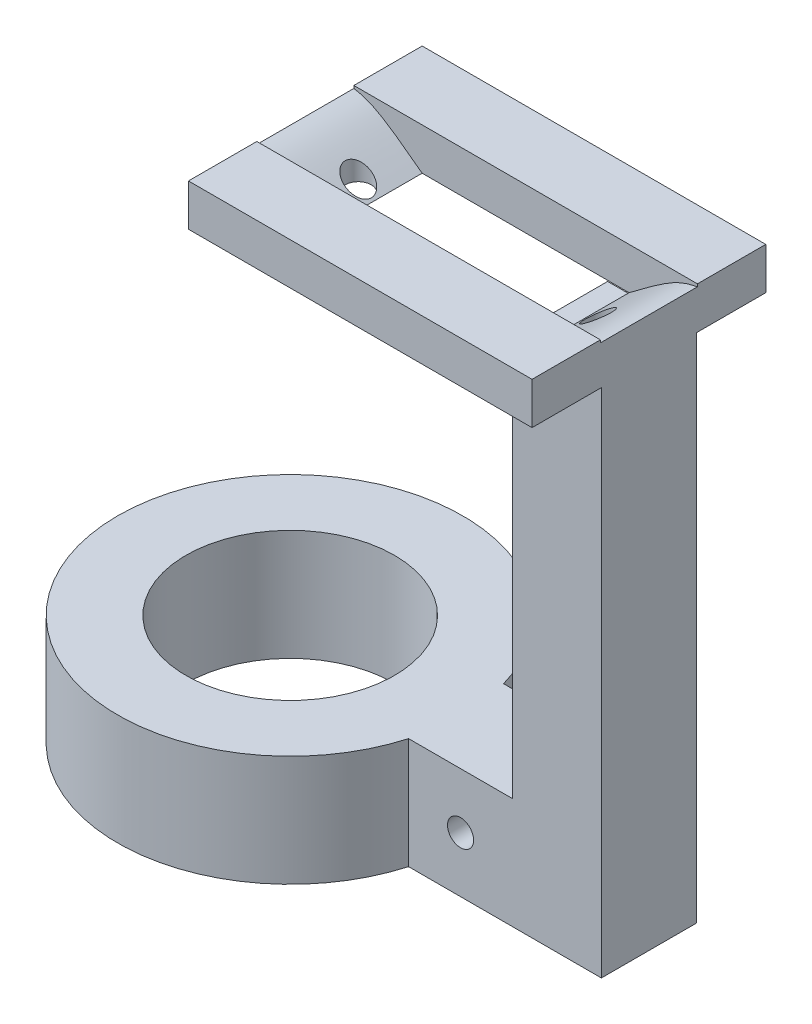
ISO-10303-21;
HEADER;
FILE_DESCRIPTION(('STEP AP214'),'2;1');
FILE_NAME('part.step','',(''),(''),'','','');
FILE_SCHEMA(('AUTOMOTIVE_DESIGN { 1 0 10303 214 1 1 1 1 }'));
ENDSEC;
DATA;
#1=APPLICATION_CONTEXT('core data for automotive mechanical design processes');
#2=APPLICATION_PROTOCOL_DEFINITION('international standard','automotive_design',2000,#1);
#3=PRODUCT_CONTEXT('',#1,'mechanical');
#4=PRODUCT('Part','Part','',(#3));
#5=PRODUCT_RELATED_PRODUCT_CATEGORY('part','',(#4));
#6=PRODUCT_DEFINITION_FORMATION('','',#4);
#7=PRODUCT_DEFINITION_CONTEXT('part definition',#1,'design');
#8=PRODUCT_DEFINITION('design','',#6,#7);
#9=PRODUCT_DEFINITION_SHAPE('','',#8);
#10=(LENGTH_UNIT() NAMED_UNIT(*) SI_UNIT(.MILLI.,.METRE.));
#11=(NAMED_UNIT(*) PLANE_ANGLE_UNIT() SI_UNIT($,.RADIAN.));
#12=(NAMED_UNIT(*) SI_UNIT($,.STERADIAN.) SOLID_ANGLE_UNIT());
#13=UNCERTAINTY_MEASURE_WITH_UNIT(LENGTH_MEASURE(1.E-05),#10,'distance_accuracy_value','');
#14=(GEOMETRIC_REPRESENTATION_CONTEXT(3) GLOBAL_UNCERTAINTY_ASSIGNED_CONTEXT((#13)) GLOBAL_UNIT_ASSIGNED_CONTEXT((#10,
#11,#12)) REPRESENTATION_CONTEXT('',''));
#15=CARTESIAN_POINT('',(0.,0.,0.));
#16=DIRECTION('',(0.,0.,1.));
#17=DIRECTION('',(1.,0.,0.));
#18=AXIS2_PLACEMENT_3D('',#15,#16,#17);
#19=CARTESIAN_POINT('',(24.2045446236148,6.125,25.25));
#20=DIRECTION('',(0.,-1.,0.));
#21=DIRECTION('',(0.,0.,-1.));
#22=AXIS2_PLACEMENT_3D('',#19,#20,#21);
#23=PLANE('',#22);
#24=DIRECTION('',(0.,0.,1.));
#25=VECTOR('',#24,1.);
#26=CARTESIAN_POINT('',(25.14,6.125,-7.1));
#27=LINE('',#26,#25);
#28=CARTESIAN_POINT('',(25.14,6.125,7.1));
#29=VERTEX_POINT('',#28);
#30=CARTESIAN_POINT('',(25.14,6.125,17.1));
#31=VERTEX_POINT('',#30);
#32=EDGE_CURVE('E210',#29,#31,#27,.T.);
#33=ORIENTED_EDGE('',*,*,#32,.F.);
#34=DIRECTION('',(-1.,0.,0.));
#35=VECTOR('',#34,1.);
#36=CARTESIAN_POINT('',(-15.14,6.125,7.1));
#37=LINE('',#36,#35);
#38=CARTESIAN_POINT('',(-25.14,6.125,7.1));
#39=VERTEX_POINT('',#38);
#40=EDGE_CURVE('E219',#29,#39,#37,.T.);
#41=ORIENTED_EDGE('',*,*,#40,.T.);
#42=DIRECTION('',(0.,0.,-1.));
#43=VECTOR('',#42,1.);
#44=CARTESIAN_POINT('',(-25.14,6.125,25.25));
#45=LINE('',#44,#43);
#46=CARTESIAN_POINT('',(-25.14,6.125,17.1));
#47=VERTEX_POINT('',#46);
#48=EDGE_CURVE('E225',#47,#39,#45,.T.);
#49=ORIENTED_EDGE('',*,*,#48,.F.);
#50=DIRECTION('',(-1.,0.,0.));
#51=VECTOR('',#50,1.);
#52=CARTESIAN_POINT('',(-15.14,6.125,17.1));
#53=LINE('',#52,#51);
#54=EDGE_CURVE('E233',#31,#47,#53,.T.);
#55=ORIENTED_EDGE('',*,*,#54,.F.);
#56=EDGE_LOOP('',(#33,#41,#49,#55));
#57=FACE_BOUND('',#56,.T.);
#58=ADVANCED_FACE('F68',(#57),#23,.F.);
#59=CARTESIAN_POINT('',(12.14,-74.82,6.955));
#60=DIRECTION('',(1.,0.,0.));
#61=DIRECTION('',(0.,0.,-1.));
#62=AXIS2_PLACEMENT_3D('',#59,#60,#61);
#63=PLANE('',#62);
#64=DIRECTION('',(0.,0.,-1.));
#65=VECTOR('',#64,1.);
#66=CARTESIAN_POINT('',(12.14,-58.59,-6.955));
#67=LINE('',#66,#65);
#68=CARTESIAN_POINT('',(12.14,-58.59,6.955));
#69=VERTEX_POINT('',#68);
#70=CARTESIAN_POINT('',(12.14,-58.59,-6.955));
#71=VERTEX_POINT('',#70);
#72=EDGE_CURVE('E259',#69,#71,#67,.T.);
#73=ORIENTED_EDGE('',*,*,#72,.F.);
#74=DIRECTION('',(0.,1.,0.));
#75=VECTOR('',#74,1.);
#76=CARTESIAN_POINT('',(12.14,-74.82,6.955));
#77=LINE('',#76,#75);
#78=CARTESIAN_POINT('',(12.14,0.,6.955));
#79=VERTEX_POINT('',#78);
#80=EDGE_CURVE('E457',#69,#79,#77,.T.);
#81=ORIENTED_EDGE('',*,*,#80,.T.);
#82=DIRECTION('',(0.,0.,-1.));
#83=VECTOR('',#82,1.);
#84=CARTESIAN_POINT('',(12.14,0.,6.955));
#85=LINE('',#84,#83);
#86=CARTESIAN_POINT('',(12.14,0.,-6.955));
#87=VERTEX_POINT('',#86);
#88=EDGE_CURVE('E279',#79,#87,#85,.T.);
#89=ORIENTED_EDGE('',*,*,#88,.T.);
#90=DIRECTION('',(0.,1.,0.));
#91=VECTOR('',#90,1.);
#92=CARTESIAN_POINT('',(12.14,-74.82,-6.955));
#93=LINE('',#92,#91);
#94=EDGE_CURVE('E461',#71,#87,#93,.T.);
#95=ORIENTED_EDGE('',*,*,#94,.F.);
#96=EDGE_LOOP('',(#73,#81,#89,#95));
#97=FACE_BOUND('',#96,.T.);
#98=ADVANCED_FACE('F317',(#97),#63,.F.);
#99=CARTESIAN_POINT('',(0.,0.,0.));
#100=DIRECTION('',(0.,1.,0.));
#101=DIRECTION('',(0.,0.,1.));
#102=AXIS2_PLACEMENT_3D('',#99,#100,#101);
#103=PLANE('',#102);
#104=CARTESIAN_POINT('',(-17.395,0.,0.));
#105=DIRECTION('',(0.,1.,0.));
#106=DIRECTION('',(0.,0.,1.));
#107=AXIS2_PLACEMENT_3D('',#104,#105,#106);
#108=CIRCLE('',#107,1.91);
#109=CARTESIAN_POINT('',(-17.395,0.,1.91));
#110=VERTEX_POINT('',#109);
#111=EDGE_CURVE('E596',#110,#110,#108,.T.);
#112=ORIENTED_EDGE('',*,*,#111,.T.);
#113=EDGE_LOOP('',(#112));
#114=FACE_BOUND('',#113,.T.);
#115=DIRECTION('',(1.,0.,0.));
#116=VECTOR('',#115,1.);
#117=CARTESIAN_POINT('',(12.14,0.,-6.955));
#118=LINE('',#117,#116);
#119=CARTESIAN_POINT('',(15.14,0.,-6.955));
#120=VERTEX_POINT('',#119);
#121=CARTESIAN_POINT('',(25.14,0.,-6.955));
#122=VERTEX_POINT('',#121);
#123=EDGE_CURVE('E216',#120,#122,#118,.T.);
#124=ORIENTED_EDGE('',*,*,#123,.F.);
#125=CARTESIAN_POINT('',(15.14,0.,-7.81));
#126=CARTESIAN_POINT('',(15.14,0.,-2.60333333333333));
#127=CARTESIAN_POINT('',(15.14,0.,2.60333333333334));
#128=CARTESIAN_POINT('',(15.14,0.,7.81000000000001));
#129=(BOUNDED_CURVE() B_SPLINE_CURVE(3,(#125,#126,#127,#128),.UNSPECIFIED.,.F.,
.F.) B_SPLINE_CURVE_WITH_KNOTS((4,4),(-0.01491,0.000710000000000001),
.UNSPECIFIED.) CURVE() GEOMETRIC_REPRESENTATION_ITEM() RATIONAL_B_SPLINE_CURVE((1.,1.,1.,1.)) REPRESENTATION_ITEM(''));
#130=CARTESIAN_POINT('',(15.14,0.,-7.1));
#131=VERTEX_POINT('',#130);
#132=EDGE_CURVE('E419',#120,#131,#129,.F.);
#133=ORIENTED_EDGE('',*,*,#132,.T.);
#134=DIRECTION('',(-1.,0.,0.));
#135=VECTOR('',#134,1.);
#136=CARTESIAN_POINT('',(-15.14,0.,-7.1));
#137=LINE('',#136,#135);
#138=CARTESIAN_POINT('',(-15.14,0.,-7.1));
#139=VERTEX_POINT('',#138);
#140=EDGE_CURVE('E450',#131,#139,#137,.T.);
#141=ORIENTED_EDGE('',*,*,#140,.T.);
#142=CARTESIAN_POINT('',(-15.14,0.,7.80999999999999));
#143=CARTESIAN_POINT('',(-15.14,0.,2.60333333333332));
#144=CARTESIAN_POINT('',(-15.14,0.,-2.60333333333333));
#145=CARTESIAN_POINT('',(-15.14,0.,-7.81));
#146=(BOUNDED_CURVE() B_SPLINE_CURVE(3,(#142,#143,#144,#145),.UNSPECIFIED.,.F.,
.F.) B_SPLINE_CURVE_WITH_KNOTS((4,4),(-0.03306,-0.01744),
.UNSPECIFIED.) CURVE() GEOMETRIC_REPRESENTATION_ITEM() RATIONAL_B_SPLINE_CURVE((1.,1.,1.,1.)) REPRESENTATION_ITEM(''));
#147=CARTESIAN_POINT('',(-15.14,0.,7.1));
#148=VERTEX_POINT('',#147);
#149=EDGE_CURVE('E452',#139,#148,#146,.F.);
#150=ORIENTED_EDGE('',*,*,#149,.T.);
#151=DIRECTION('',(1.,0.,0.));
#152=VECTOR('',#151,1.);
#153=CARTESIAN_POINT('',(-15.14,0.,7.1));
#154=LINE('',#153,#152);
#155=CARTESIAN_POINT('',(15.14,0.,7.1));
#156=VERTEX_POINT('',#155);
#157=EDGE_CURVE('E867',#148,#156,#154,.T.);
#158=ORIENTED_EDGE('',*,*,#157,.T.);
#159=CARTESIAN_POINT('',(15.14,0.,-7.81));
#160=CARTESIAN_POINT('',(15.14,0.,-2.60333333333333));
#161=CARTESIAN_POINT('',(15.14,0.,2.60333333333334));
#162=CARTESIAN_POINT('',(15.14,0.,7.81000000000001));
#163=(BOUNDED_CURVE() B_SPLINE_CURVE(3,(#159,#160,#161,#162),.UNSPECIFIED.,.F.,
.F.) B_SPLINE_CURVE_WITH_KNOTS((4,4),(-0.01491,0.000710000000000001),
.UNSPECIFIED.) CURVE() GEOMETRIC_REPRESENTATION_ITEM() RATIONAL_B_SPLINE_CURVE((1.,1.,1.,1.)) REPRESENTATION_ITEM(''));
#164=CARTESIAN_POINT('',(15.14,0.,6.955));
#165=VERTEX_POINT('',#164);
#166=EDGE_CURVE('E438',#156,#165,#163,.F.);
#167=ORIENTED_EDGE('',*,*,#166,.T.);
#168=DIRECTION('',(-1.,0.,0.));
#169=VECTOR('',#168,1.);
#170=CARTESIAN_POINT('',(12.14,0.,6.955));
#171=LINE('',#170,#169);
#172=CARTESIAN_POINT('',(25.14,0.,6.955));
#173=VERTEX_POINT('',#172);
#174=EDGE_CURVE('E285',#173,#165,#171,.T.);
#175=ORIENTED_EDGE('',*,*,#174,.F.);
#176=DIRECTION('',(0.,0.,-1.));
#177=VECTOR('',#176,1.);
#178=CARTESIAN_POINT('',(25.14,0.,-7.1));
#179=LINE('',#178,#177);
#180=CARTESIAN_POINT('',(25.14,0.,17.1));
#181=VERTEX_POINT('',#180);
#182=EDGE_CURVE('E465',#181,#173,#179,.T.);
#183=ORIENTED_EDGE('',*,*,#182,.F.);
#184=DIRECTION('',(1.,0.,0.));
#185=VECTOR('',#184,1.);
#186=CARTESIAN_POINT('',(-15.14,0.,17.1));
#187=LINE('',#186,#185);
#188=CARTESIAN_POINT('',(-25.14,0.,17.1));
#189=VERTEX_POINT('',#188);
#190=EDGE_CURVE('E473',#189,#181,#187,.T.);
#191=ORIENTED_EDGE('',*,*,#190,.F.);
#192=DIRECTION('',(0.,0.,1.));
#193=VECTOR('',#192,1.);
#194=CARTESIAN_POINT('',(-25.14,0.,-7.1));
#195=LINE('',#194,#193);
#196=CARTESIAN_POINT('',(-25.14,0.,-17.1));
#197=VERTEX_POINT('',#196);
#198=EDGE_CURVE('E470',#197,#189,#195,.T.);
#199=ORIENTED_EDGE('',*,*,#198,.F.);
#200=DIRECTION('',(-1.,0.,0.));
#201=VECTOR('',#200,1.);
#202=CARTESIAN_POINT('',(-15.14,0.,-17.1));
#203=LINE('',#202,#201);
#204=CARTESIAN_POINT('',(25.14,0.,-17.1));
#205=VERTEX_POINT('',#204);
#206=EDGE_CURVE('E468',#205,#197,#203,.T.);
#207=ORIENTED_EDGE('',*,*,#206,.F.);
#208=EDGE_CURVE('E214',#122,#205,#179,.T.);
#209=ORIENTED_EDGE('',*,*,#208,.F.);
#210=EDGE_LOOP('',(#124,#133,#141,#150,#158,#167,#175,#183,#191,#199,#207,#209));
#211=FACE_BOUND('',#210,.T.);
#212=ADVANCED_FACE('F320',(#114,#211),#103,.F.);
#213=CARTESIAN_POINT('',(25.14,12.25,-7.1));
#214=DIRECTION('',(-1.,0.,0.));
#215=DIRECTION('',(0.,0.,1.));
#216=AXIS2_PLACEMENT_3D('',#213,#214,#215);
#217=PLANE('',#216);
#218=CARTESIAN_POINT('',(25.14,5.7457363650206,7.81));
#219=CARTESIAN_POINT('',(25.14,5.7457363650206,2.60333333333333));
#220=CARTESIAN_POINT('',(25.14,5.7457363650206,-2.60333333333333));
#221=CARTESIAN_POINT('',(25.14,5.7457363650206,-7.81));
#222=(BOUNDED_CURVE() B_SPLINE_CURVE(3,(#218,#219,#220,#221),.UNSPECIFIED.,.F.,
.F.) B_SPLINE_CURVE_WITH_KNOTS((4,4),(-0.01491,0.00071),
.UNSPECIFIED.) CURVE() GEOMETRIC_REPRESENTATION_ITEM() RATIONAL_B_SPLINE_CURVE((1.82212779451616,
1.82212779451616,1.82212779451616,1.82212779451616)) REPRESENTATION_ITEM(''));
#223=CARTESIAN_POINT('',(25.14,5.74573636502059,-7.1));
#224=VERTEX_POINT('',#223);
#225=CARTESIAN_POINT('',(25.14,5.74573636502059,7.1));
#226=VERTEX_POINT('',#225);
#227=EDGE_CURVE('E399',#224,#226,#222,.F.);
#228=ORIENTED_EDGE('',*,*,#227,.T.);
#229=CARTESIAN_POINT('',(25.14,5.74573636502059,7.1));
#230=DIRECTION('',(0.,1.,0.));
#231=VECTOR('',#230,1.);
#232=LINE('',#229,#231);
#233=EDGE_CURVE('E99',#226,#29,#232,.T.);
#234=ORIENTED_EDGE('',*,*,#233,.T.);
#235=ORIENTED_EDGE('',*,*,#32,.T.);
#236=DIRECTION('',(0.,-1.,0.));
#237=VECTOR('',#236,1.);
#238=CARTESIAN_POINT('',(25.14,12.25,17.1));
#239=LINE('',#238,#237);
#240=EDGE_CURVE('E476',#31,#181,#239,.T.);
#241=ORIENTED_EDGE('',*,*,#240,.T.);
#242=ORIENTED_EDGE('',*,*,#182,.T.);
#243=DIRECTION('',(0.,1.,0.));
#244=VECTOR('',#243,1.);
#245=CARTESIAN_POINT('',(25.14,-74.82,6.955));
#246=LINE('',#245,#244);
#247=CARTESIAN_POINT('',(25.14,-74.82,6.955));
#248=VERTEX_POINT('',#247);
#249=EDGE_CURVE('E454',#248,#173,#246,.T.);
#250=ORIENTED_EDGE('',*,*,#249,.F.);
#251=DIRECTION('',(0.,0.,1.));
#252=VECTOR('',#251,1.);
#253=CARTESIAN_POINT('',(25.14,-74.82,6.955));
#254=LINE('',#253,#252);
#255=CARTESIAN_POINT('',(25.14,-74.82,-6.955));
#256=VERTEX_POINT('',#255);
#257=EDGE_CURVE('E267',#256,#248,#254,.T.);
#258=ORIENTED_EDGE('',*,*,#257,.F.);
#259=DIRECTION('',(0.,1.,0.));
#260=VECTOR('',#259,1.);
#261=CARTESIAN_POINT('',(25.14,-74.82,-6.955));
#262=LINE('',#261,#260);
#263=EDGE_CURVE('E276',#256,#122,#262,.T.);
#264=ORIENTED_EDGE('',*,*,#263,.T.);
#265=ORIENTED_EDGE('',*,*,#208,.T.);
#266=DIRECTION('',(0.,-1.,0.));
#267=VECTOR('',#266,1.);
#268=CARTESIAN_POINT('',(25.14,12.25,-17.1));
#269=LINE('',#268,#267);
#270=CARTESIAN_POINT('',(25.14,6.125,-17.1));
#271=VERTEX_POINT('',#270);
#272=EDGE_CURVE('E200',#271,#205,#269,.T.);
#273=ORIENTED_EDGE('',*,*,#272,.F.);
#274=CARTESIAN_POINT('',(25.14,6.125,-7.1));
#275=VERTEX_POINT('',#274);
#276=EDGE_CURVE('E204',#271,#275,#27,.T.);
#277=ORIENTED_EDGE('',*,*,#276,.T.);
#278=CARTESIAN_POINT('',(25.14,6.125,-7.1));
#279=DIRECTION('',(0.,-1.,0.));
#280=VECTOR('',#279,1.);
#281=LINE('',#278,#280);
#282=EDGE_CURVE('E376',#275,#224,#281,.T.);
#283=ORIENTED_EDGE('',*,*,#282,.T.);
#284=EDGE_LOOP('',(#228,#234,#235,#241,#242,#250,#258,#264,#265,#273,#277,#283));
#285=FACE_BOUND('',#284,.T.);
#286=ADVANCED_FACE('F212',(#285),#217,.F.);
#287=CARTESIAN_POINT('',(-15.14,12.25,-17.1));
#288=DIRECTION('',(0.,0.,1.));
#289=DIRECTION('',(1.,0.,0.));
#290=AXIS2_PLACEMENT_3D('',#287,#288,#289);
#291=PLANE('',#290);
#292=DIRECTION('',(-1.,0.,0.));
#293=VECTOR('',#292,1.);
#294=CARTESIAN_POINT('',(24.2045446236148,6.125,-17.1));
#295=LINE('',#294,#293);
#296=CARTESIAN_POINT('',(-25.14,6.125,-17.1));
#297=VERTEX_POINT('',#296);
#298=EDGE_CURVE('E196',#271,#297,#295,.T.);
#299=ORIENTED_EDGE('',*,*,#298,.F.);
#300=ORIENTED_EDGE('',*,*,#272,.T.);
#301=ORIENTED_EDGE('',*,*,#206,.T.);
#302=DIRECTION('',(0.,-1.,0.));
#303=VECTOR('',#302,1.);
#304=CARTESIAN_POINT('',(-25.14,12.25,-17.1));
#305=LINE('',#304,#303);
#306=EDGE_CURVE('E202',#297,#197,#305,.T.);
#307=ORIENTED_EDGE('',*,*,#306,.F.);
#308=EDGE_LOOP('',(#299,#300,#301,#307));
#309=FACE_BOUND('',#308,.T.);
#310=ADVANCED_FACE('F197',(#309),#291,.F.);
#311=CARTESIAN_POINT('',(-25.14,12.25,-7.1));
#312=DIRECTION('',(1.,0.,0.));
#313=DIRECTION('',(0.,0.,-1.));
#314=AXIS2_PLACEMENT_3D('',#311,#312,#313);
#315=PLANE('',#314);
#316=CARTESIAN_POINT('',(-25.14,5.7457363650206,-7.81));
#317=CARTESIAN_POINT('',(-25.14,5.7457363650206,-2.60333333333334));
#318=CARTESIAN_POINT('',(-25.14,5.7457363650206,2.60333333333333));
#319=CARTESIAN_POINT('',(-25.14,5.7457363650206,7.80999999999999));
#320=(BOUNDED_CURVE() B_SPLINE_CURVE(3,(#316,#317,#318,#319),.UNSPECIFIED.,.F.,
.F.) B_SPLINE_CURVE_WITH_KNOTS((4,4),(-0.03306,-0.01744),
.UNSPECIFIED.) CURVE() GEOMETRIC_REPRESENTATION_ITEM() RATIONAL_B_SPLINE_CURVE((1.82212779451616,
1.82212779451616,1.82212779451616,1.82212779451616)) REPRESENTATION_ITEM(''));
#321=CARTESIAN_POINT('',(-25.14,5.7457363650206,7.1));
#322=VERTEX_POINT('',#321);
#323=CARTESIAN_POINT('',(-25.14,5.7457363650206,-7.1));
#324=VERTEX_POINT('',#323);
#325=EDGE_CURVE('E499',#322,#324,#320,.F.);
#326=ORIENTED_EDGE('',*,*,#325,.T.);
#327=CARTESIAN_POINT('',(-25.14,5.7457363650206,-7.1));
#328=DIRECTION('',(0.,1.,0.));
#329=VECTOR('',#328,1.);
#330=LINE('',#327,#329);
#331=CARTESIAN_POINT('',(-25.14,6.125,-7.1));
#332=VERTEX_POINT('',#331);
#333=EDGE_CURVE('E512',#324,#332,#330,.T.);
#334=ORIENTED_EDGE('',*,*,#333,.T.);
#335=EDGE_CURVE('E203',#332,#297,#45,.T.);
#336=ORIENTED_EDGE('',*,*,#335,.T.);
#337=ORIENTED_EDGE('',*,*,#306,.T.);
#338=ORIENTED_EDGE('',*,*,#198,.T.);
#339=DIRECTION('',(0.,-1.,0.));
#340=VECTOR('',#339,1.);
#341=CARTESIAN_POINT('',(-25.14,12.25,17.1));
#342=LINE('',#341,#340);
#343=EDGE_CURVE('E221',#47,#189,#342,.T.);
#344=ORIENTED_EDGE('',*,*,#343,.F.);
#345=ORIENTED_EDGE('',*,*,#48,.T.);
#346=CARTESIAN_POINT('',(-25.14,6.125,7.1));
#347=DIRECTION('',(0.,-1.,0.));
#348=VECTOR('',#347,1.);
#349=LINE('',#346,#348);
#350=EDGE_CURVE('E496',#39,#322,#349,.T.);
#351=ORIENTED_EDGE('',*,*,#350,.T.);
#352=EDGE_LOOP('',(#326,#334,#336,#337,#338,#344,#345,#351));
#353=FACE_BOUND('',#352,.T.);
#354=ADVANCED_FACE('F487',(#353),#315,.F.);
#355=CARTESIAN_POINT('',(-15.14,12.25,17.1));
#356=DIRECTION('',(0.,0.,-1.));
#357=DIRECTION('',(-1.,0.,0.));
#358=AXIS2_PLACEMENT_3D('',#355,#356,#357);
#359=PLANE('',#358);
#360=ORIENTED_EDGE('',*,*,#240,.F.);
#361=ORIENTED_EDGE('',*,*,#54,.T.);
#362=ORIENTED_EDGE('',*,*,#343,.T.);
#363=ORIENTED_EDGE('',*,*,#190,.T.);
#364=EDGE_LOOP('',(#360,#361,#362,#363));
#365=FACE_BOUND('',#364,.T.);
#366=ADVANCED_FACE('F480',(#365),#359,.F.);
#367=CARTESIAN_POINT('',(-15.14,12.25,-7.1));
#368=DIRECTION('',(0.,0.,1.));
#369=DIRECTION('',(1.,0.,0.));
#370=AXIS2_PLACEMENT_3D('',#367,#368,#369);
#371=PLANE('',#370);
#372=DIRECTION('',(1.,0.,0.));
#373=VECTOR('',#372,1.);
#374=CARTESIAN_POINT('',(-15.14,6.125,-7.1));
#375=LINE('',#374,#373);
#376=EDGE_CURVE('E91',#332,#275,#375,.T.);
#377=ORIENTED_EDGE('',*,*,#376,.F.);
#378=ORIENTED_EDGE('',*,*,#333,.F.);
#379=CARTESIAN_POINT('',(-15.14,0.,-7.1));
#380=CARTESIAN_POINT('',(-23.1901279874825,6.12500000000001,-7.1));
#381=CARTESIAN_POINT('',(-33.3054720555234,6.125,-7.1));
#382=(BOUNDED_CURVE() B_SPLINE_CURVE(2,(#379,#380,#381),.UNSPECIFIED.,.F.,
.F.) B_SPLINE_CURVE_WITH_KNOTS((3,3),(0.,1.),
.UNSPECIFIED.) CURVE() GEOMETRIC_REPRESENTATION_ITEM() RATIONAL_B_SPLINE_CURVE((1.,
2.84275394643996,1.)) REPRESENTATION_ITEM(''));
#383=EDGE_CURVE('E511',#324,#139,#382,.F.);
#384=ORIENTED_EDGE('',*,*,#383,.T.);
#385=ORIENTED_EDGE('',*,*,#140,.F.);
#386=CARTESIAN_POINT('',(33.3054720555234,6.125,-7.1));
#387=CARTESIAN_POINT('',(23.1901279874825,6.125,-7.1));
#388=CARTESIAN_POINT('',(15.14,0.,-7.1));
#389=(BOUNDED_CURVE() B_SPLINE_CURVE(2,(#386,#387,#388),.UNSPECIFIED.,.F.,
.F.) B_SPLINE_CURVE_WITH_KNOTS((3,3),(0.,1.),
.UNSPECIFIED.) CURVE() GEOMETRIC_REPRESENTATION_ITEM() RATIONAL_B_SPLINE_CURVE((1.,
2.84275394643997,1.)) REPRESENTATION_ITEM(''));
#390=EDGE_CURVE('E13',#131,#224,#389,.F.);
#391=ORIENTED_EDGE('',*,*,#390,.T.);
#392=ORIENTED_EDGE('',*,*,#282,.F.);
#393=EDGE_LOOP('',(#377,#378,#384,#385,#391,#392));
#394=FACE_BOUND('',#393,.T.);
#395=ADVANCED_FACE('F328',(#394),#371,.T.);
#396=CARTESIAN_POINT('',(-15.14,12.25,7.1));
#397=DIRECTION('',(0.,0.,-1.));
#398=DIRECTION('',(-1.,0.,0.));
#399=AXIS2_PLACEMENT_3D('',#396,#397,#398);
#400=PLANE('',#399);
#401=ORIENTED_EDGE('',*,*,#40,.F.);
#402=ORIENTED_EDGE('',*,*,#233,.F.);
#403=CARTESIAN_POINT('',(15.14,0.,7.1));
#404=CARTESIAN_POINT('',(23.1901279874825,6.125,7.1));
#405=CARTESIAN_POINT('',(33.3054720555234,6.125,7.1));
#406=(BOUNDED_CURVE() B_SPLINE_CURVE(2,(#403,#404,#405),.UNSPECIFIED.,.F.,
.F.) B_SPLINE_CURVE_WITH_KNOTS((3,3),(0.,1.),
.UNSPECIFIED.) CURVE() GEOMETRIC_REPRESENTATION_ITEM() RATIONAL_B_SPLINE_CURVE((1.,
2.84275394643997,1.)) REPRESENTATION_ITEM(''));
#407=EDGE_CURVE('E84',#226,#156,#406,.F.);
#408=ORIENTED_EDGE('',*,*,#407,.T.);
#409=ORIENTED_EDGE('',*,*,#157,.F.);
#410=CARTESIAN_POINT('',(-33.3054720555234,6.125,7.1));
#411=CARTESIAN_POINT('',(-23.1901279874825,6.125,7.1));
#412=CARTESIAN_POINT('',(-15.14,0.,7.1));
#413=(BOUNDED_CURVE() B_SPLINE_CURVE(2,(#410,#411,#412),.UNSPECIFIED.,.F.,
.F.) B_SPLINE_CURVE_WITH_KNOTS((3,3),(0.,1.),
.UNSPECIFIED.) CURVE() GEOMETRIC_REPRESENTATION_ITEM() RATIONAL_B_SPLINE_CURVE((1.,
2.84275394643997,1.)) REPRESENTATION_ITEM(''));
#414=EDGE_CURVE('E508',#148,#322,#413,.F.);
#415=ORIENTED_EDGE('',*,*,#414,.T.);
#416=ORIENTED_EDGE('',*,*,#350,.F.);
#417=EDGE_LOOP('',(#401,#402,#408,#409,#415,#416));
#418=FACE_BOUND('',#417,.T.);
#419=ADVANCED_FACE('F310',(#418),#400,.T.);
#420=CARTESIAN_POINT('',(0.,0.,0.));
#421=DIRECTION('',(0.,-1.,0.));
#422=DIRECTION('',(0.,0.,-1.));
#423=AXIS2_PLACEMENT_3D('',#420,#421,#422);
#424=PLANE('',#423);
#425=EDGE_CURVE('E266',#165,#79,#171,.T.);
#426=ORIENTED_EDGE('',*,*,#425,.F.);
#427=CARTESIAN_POINT('',(15.14,0.,-7.81));
#428=CARTESIAN_POINT('',(15.14,0.,-2.60333333333333));
#429=CARTESIAN_POINT('',(15.14,0.,2.60333333333334));
#430=CARTESIAN_POINT('',(15.14,0.,7.81000000000001));
#431=(BOUNDED_CURVE() B_SPLINE_CURVE(3,(#427,#428,#429,#430),.UNSPECIFIED.,.F.,
.F.) B_SPLINE_CURVE_WITH_KNOTS((4,4),(-0.01491,0.000710000000000001),
.UNSPECIFIED.) CURVE() GEOMETRIC_REPRESENTATION_ITEM() RATIONAL_B_SPLINE_CURVE((1.,1.,1.,1.)) REPRESENTATION_ITEM(''));
#432=EDGE_CURVE('E293',#165,#120,#431,.F.);
#433=ORIENTED_EDGE('',*,*,#432,.T.);
#434=EDGE_CURVE('E271',#87,#120,#118,.T.);
#435=ORIENTED_EDGE('',*,*,#434,.F.);
#436=ORIENTED_EDGE('',*,*,#88,.F.);
#437=EDGE_LOOP('',(#426,#433,#435,#436));
#438=FACE_BOUND('',#437,.T.);
#439=ADVANCED_FACE('F299',(#438),#424,.F.);
#440=CARTESIAN_POINT('',(12.14,-74.82,6.955));
#441=DIRECTION('',(0.,0.,-1.));
#442=DIRECTION('',(-1.,0.,0.));
#443=AXIS2_PLACEMENT_3D('',#440,#441,#442);
#444=PLANE('',#443);
#445=CARTESIAN_POINT('',(4.53088324795324,-66.705,6.955));
#446=DIRECTION('',(0.,0.,-1.));
#447=DIRECTION('',(-1.,0.,0.));
#448=AXIS2_PLACEMENT_3D('',#445,#446,#447);
#449=CIRCLE('',#448,1.91);
#450=CARTESIAN_POINT('',(2.62088324795324,-66.705,6.955));
#451=VERTEX_POINT('',#450);
#452=EDGE_CURVE('E240',#451,#451,#449,.T.);
#453=ORIENTED_EDGE('',*,*,#452,.T.);
#454=EDGE_LOOP('',(#453));
#455=FACE_BOUND('',#454,.T.);
#456=DIRECTION('',(1.,0.,0.));
#457=VECTOR('',#456,1.);
#458=CARTESIAN_POINT('',(-3.07999999999999,-58.59,6.95499999999999));
#459=LINE('',#458,#457);
#460=CARTESIAN_POINT('',(-3.07823350409353,-58.59,6.95499999999999));
#461=VERTEX_POINT('',#460);
#462=EDGE_CURVE('E264',#461,#69,#459,.T.);
#463=ORIENTED_EDGE('',*,*,#462,.F.);
#464=DIRECTION('',(0.,-1.,0.));
#465=VECTOR('',#464,1.);
#466=CARTESIAN_POINT('',(-3.07823350409353,-58.59,6.955));
#467=LINE('',#466,#465);
#468=CARTESIAN_POINT('',(-3.07823350409353,-74.82,6.955));
#469=VERTEX_POINT('',#468);
#470=EDGE_CURVE('E257',#461,#469,#467,.T.);
#471=ORIENTED_EDGE('',*,*,#470,.T.);
#472=DIRECTION('',(-1.,0.,0.));
#473=VECTOR('',#472,1.);
#474=CARTESIAN_POINT('',(12.14,-74.82,6.955));
#475=LINE('',#474,#473);
#476=EDGE_CURVE('E270',#248,#469,#475,.T.);
#477=ORIENTED_EDGE('',*,*,#476,.F.);
#478=ORIENTED_EDGE('',*,*,#249,.T.);
#479=ORIENTED_EDGE('',*,*,#174,.T.);
#480=ORIENTED_EDGE('',*,*,#425,.T.);
#481=ORIENTED_EDGE('',*,*,#80,.F.);
#482=EDGE_LOOP('',(#463,#471,#477,#478,#479,#480,#481));
#483=FACE_BOUND('',#482,.T.);
#484=ADVANCED_FACE('F309',(#455,#483),#444,.F.);
#485=CARTESIAN_POINT('',(12.14,-74.82,-6.955));
#486=DIRECTION('',(0.,0.,1.));
#487=DIRECTION('',(1.,0.,0.));
#488=AXIS2_PLACEMENT_3D('',#485,#486,#487);
#489=PLANE('',#488);
#490=CARTESIAN_POINT('',(4.53088324795324,-66.705,-6.955));
#491=DIRECTION('',(0.,0.,-1.));
#492=DIRECTION('',(-1.,0.,0.));
#493=AXIS2_PLACEMENT_3D('',#490,#491,#492);
#494=CIRCLE('',#493,1.91);
#495=CARTESIAN_POINT('',(2.62088324795324,-66.705,-6.955));
#496=VERTEX_POINT('',#495);
#497=EDGE_CURVE('E237',#496,#496,#494,.T.);
#498=ORIENTED_EDGE('',*,*,#497,.F.);
#499=EDGE_LOOP('',(#498));
#500=FACE_BOUND('',#499,.T.);
#501=DIRECTION('',(1.,0.,0.));
#502=VECTOR('',#501,1.);
#503=CARTESIAN_POINT('',(12.14,-74.82,-6.955));
#504=LINE('',#503,#502);
#505=CARTESIAN_POINT('',(-3.07823350409353,-74.82,-6.955));
#506=VERTEX_POINT('',#505);
#507=EDGE_CURVE('E274',#506,#256,#504,.T.);
#508=ORIENTED_EDGE('',*,*,#507,.F.);
#509=DIRECTION('',(0.,-1.,0.));
#510=VECTOR('',#509,1.);
#511=CARTESIAN_POINT('',(-3.07823350409353,-58.59,-6.955));
#512=LINE('',#511,#510);
#513=CARTESIAN_POINT('',(-3.07823350409353,-58.59,-6.95500000000001));
#514=VERTEX_POINT('',#513);
#515=EDGE_CURVE('E253',#506,#514,#512,.F.);
#516=ORIENTED_EDGE('',*,*,#515,.T.);
#517=DIRECTION('',(1.,0.,0.));
#518=VECTOR('',#517,1.);
#519=CARTESIAN_POINT('',(-3.07999999999999,-58.59,-6.95500000000001));
#520=LINE('',#519,#518);
#521=EDGE_CURVE('E262',#514,#71,#520,.T.);
#522=ORIENTED_EDGE('',*,*,#521,.T.);
#523=ORIENTED_EDGE('',*,*,#94,.T.);
#524=ORIENTED_EDGE('',*,*,#434,.T.);
#525=ORIENTED_EDGE('',*,*,#123,.T.);
#526=ORIENTED_EDGE('',*,*,#263,.F.);
#527=EDGE_LOOP('',(#508,#516,#522,#523,#524,#525,#526));
#528=FACE_BOUND('',#527,.T.);
#529=ADVANCED_FACE('F313',(#500,#528),#489,.F.);
#530=CARTESIAN_POINT('',(0.,-74.82,0.));
#531=DIRECTION('',(0.,-1.,0.));
#532=DIRECTION('',(0.,0.,-1.));
#533=AXIS2_PLACEMENT_3D('',#530,#531,#532);
#534=PLANE('',#533);
#535=CARTESIAN_POINT('',(-27.351479578733,-74.82,0.));
#536=DIRECTION('',(0.,-1.,0.));
#537=DIRECTION('',(1.,0.,0.));
#538=AXIS2_PLACEMENT_3D('',#535,#536,#537);
#539=CIRCLE('',#538,25.25);
#540=EDGE_CURVE('E247',#469,#506,#539,.T.);
#541=ORIENTED_EDGE('',*,*,#540,.T.);
#542=ORIENTED_EDGE('',*,*,#507,.T.);
#543=ORIENTED_EDGE('',*,*,#257,.T.);
#544=ORIENTED_EDGE('',*,*,#476,.T.);
#545=EDGE_LOOP('',(#541,#542,#543,#544));
#546=FACE_BOUND('',#545,.T.);
#547=CARTESIAN_POINT('',(-27.351479578733,-74.82,0.));
#548=DIRECTION('',(0.,-1.,0.));
#549=DIRECTION('',(0.,0.,-1.));
#550=AXIS2_PLACEMENT_3D('',#547,#548,#549);
#551=CIRCLE('',#550,15.25);
#552=CARTESIAN_POINT('',(-27.351479578733,-74.82,-15.25));
#553=VERTEX_POINT('',#552);
#554=EDGE_CURVE('E243',#553,#553,#551,.T.);
#555=ORIENTED_EDGE('',*,*,#554,.F.);
#556=EDGE_LOOP('',(#555));
#557=FACE_BOUND('',#556,.T.);
#558=ADVANCED_FACE('F311',(#546,#557),#534,.T.);
#559=CARTESIAN_POINT('',(-3.07999999999999,-58.59,-6.95500000000001));
#560=DIRECTION('',(0.,-1.,0.));
#561=DIRECTION('',(0.,0.,-1.));
#562=AXIS2_PLACEMENT_3D('',#559,#560,#561);
#563=PLANE('',#562);
#564=CARTESIAN_POINT('',(-27.351479578733,-58.59,0.));
#565=DIRECTION('',(0.,-1.,0.));
#566=DIRECTION('',(1.,0.,0.));
#567=AXIS2_PLACEMENT_3D('',#564,#565,#566);
#568=CIRCLE('',#567,25.25);
#569=EDGE_CURVE('E250',#461,#514,#568,.T.);
#570=ORIENTED_EDGE('',*,*,#569,.F.);
#571=ORIENTED_EDGE('',*,*,#462,.T.);
#572=ORIENTED_EDGE('',*,*,#72,.T.);
#573=ORIENTED_EDGE('',*,*,#521,.F.);
#574=EDGE_LOOP('',(#570,#571,#572,#573));
#575=FACE_BOUND('',#574,.T.);
#576=CARTESIAN_POINT('',(-27.351479578733,-58.59,0.));
#577=DIRECTION('',(0.,-1.,0.));
#578=DIRECTION('',(0.,0.,-1.));
#579=AXIS2_PLACEMENT_3D('',#576,#577,#578);
#580=CIRCLE('',#579,15.25);
#581=CARTESIAN_POINT('',(-27.351479578733,-58.59,-15.25));
#582=VERTEX_POINT('',#581);
#583=EDGE_CURVE('E244',#582,#582,#580,.T.);
#584=ORIENTED_EDGE('',*,*,#583,.T.);
#585=EDGE_LOOP('',(#584));
#586=FACE_BOUND('',#585,.T.);
#587=ADVANCED_FACE('F623',(#575,#586),#563,.F.);
#588=CARTESIAN_POINT('',(-27.351479578733,-58.59,0.));
#589=DIRECTION('',(0.,-1.,0.));
#590=DIRECTION('',(0.,0.,-1.));
#591=AXIS2_PLACEMENT_3D('',#588,#589,#590);
#592=CYLINDRICAL_SURFACE('',#591,25.25);
#593=ORIENTED_EDGE('',*,*,#470,.F.);
#594=ORIENTED_EDGE('',*,*,#569,.T.);
#595=ORIENTED_EDGE('',*,*,#515,.F.);
#596=ORIENTED_EDGE('',*,*,#540,.F.);
#597=EDGE_LOOP('',(#593,#594,#595,#596));
#598=FACE_BOUND('',#597,.T.);
#599=ADVANCED_FACE('F620',(#598),#592,.T.);
#600=CARTESIAN_POINT('',(-27.351479578733,-58.59,0.));
#601=DIRECTION('',(0.,-1.,0.));
#602=DIRECTION('',(0.,0.,-1.));
#603=AXIS2_PLACEMENT_3D('',#600,#601,#602);
#604=CYLINDRICAL_SURFACE('',#603,15.25);
#605=ORIENTED_EDGE('',*,*,#583,.F.);
#606=EDGE_LOOP('',(#605));
#607=FACE_BOUND('',#606,.T.);
#608=ORIENTED_EDGE('',*,*,#554,.T.);
#609=EDGE_LOOP('',(#608));
#610=FACE_BOUND('',#609,.T.);
#611=ADVANCED_FACE('F616',(#607,#610),#604,.F.);
#612=CARTESIAN_POINT('',(4.53088324795324,-66.705,25.25));
#613=DIRECTION('',(0.,0.,-1.));
#614=DIRECTION('',(-1.,0.,0.));
#615=AXIS2_PLACEMENT_3D('',#612,#613,#614);
#616=CYLINDRICAL_SURFACE('',#615,1.91);
#617=ORIENTED_EDGE('',*,*,#497,.T.);
#618=EDGE_LOOP('',(#617));
#619=FACE_BOUND('',#618,.T.);
#620=ORIENTED_EDGE('',*,*,#452,.F.);
#621=EDGE_LOOP('',(#620));
#622=FACE_BOUND('',#621,.T.);
#623=ADVANCED_FACE('F613',(#619,#622),#616,.F.);
#624=ORIENTED_EDGE('',*,*,#376,.T.);
#625=ORIENTED_EDGE('',*,*,#276,.F.);
#626=ORIENTED_EDGE('',*,*,#298,.T.);
#627=ORIENTED_EDGE('',*,*,#335,.F.);
#628=EDGE_LOOP('',(#624,#625,#626,#627));
#629=FACE_BOUND('',#628,.T.);
#630=ADVANCED_FACE('F207',(#629),#23,.F.);
#631=CARTESIAN_POINT('',(17.69,-3.875,0.));
#632=DIRECTION('',(0.,1.,0.));
#633=DIRECTION('',(0.,0.,1.));
#634=AXIS2_PLACEMENT_3D('',#631,#632,#633);
#635=CYLINDRICAL_SURFACE('',#634,1.91);
#636=CARTESIAN_POINT('',(17.69,-3.875,0.));
#637=DIRECTION('',(0.,1.,0.));
#638=DIRECTION('',(0.,0.,1.));
#639=AXIS2_PLACEMENT_3D('',#636,#637,#638);
#640=CIRCLE('',#639,1.91);
#641=CARTESIAN_POINT('',(17.69,-3.875,1.91));
#642=VERTEX_POINT('',#641);
#643=EDGE_CURVE('E492',#642,#642,#640,.T.);
#644=ORIENTED_EDGE('',*,*,#643,.F.);
#645=EDGE_LOOP('',(#644));
#646=FACE_BOUND('',#645,.T.);
#647=CARTESIAN_POINT('',(19.1354502442826,2.94009257939289,-1.24850854674818));
#648=CARTESIAN_POINT('',(19.0571912675472,2.88575639190024,-1.33910692132039));
#649=CARTESIAN_POINT('',(18.9719247220576,2.82623944902689,-1.42057408077357));
#650=CARTESIAN_POINT('',(18.7916312535237,2.69960095739968,-1.56456595256409));
#651=CARTESIAN_POINT('',(18.6965913513051,2.63246928365415,-1.62706502844282));
#652=CARTESIAN_POINT('',(18.5008563618796,2.49340511110126,-1.73288801391851));
#653=CARTESIAN_POINT('',(18.4002039775146,2.42150824112481,-1.7763390366632));
#654=CARTESIAN_POINT('',(18.1953264519625,2.27440144662804,-1.84510898476601));
#655=CARTESIAN_POINT('',(18.0911021244767,2.19919227556342,-1.87043201135212));
#656=CARTESIAN_POINT('',(17.8639694620825,2.03454034045296,-1.90607333838967));
#657=CARTESIAN_POINT('',(17.7407922858925,1.94478078878732,-1.91326166185275));
#658=CARTESIAN_POINT('',(17.4953048060538,1.765086204663,-1.90402690752113));
#659=CARTESIAN_POINT('',(17.3729957490303,1.6751510919306,-1.88757489773105));
#660=CARTESIAN_POINT('',(17.1226978388935,1.49041258196017,-1.82867218677302));
#661=CARTESIAN_POINT('',(16.9950166648359,1.39578112035336,-1.78428223977896));
#662=CARTESIAN_POINT('',(16.810348689487,1.25847113645219,-1.69674765932512));
#663=CARTESIAN_POINT('',(16.7499545635967,1.21348866484382,-1.66409266480375));
#664=CARTESIAN_POINT('',(16.6319515464471,1.12547063825517,-1.59167464993505));
#665=CARTESIAN_POINT('',(16.5743450316059,1.08243674636576,-1.55190569604242));
#666=CARTESIAN_POINT('',(16.4386223255319,0.980917716939199,-1.4465079098369));
#667=CARTESIAN_POINT('',(16.3623675727648,0.92376715972545,-1.37712100940236));
#668=CARTESIAN_POINT('',(16.2198294551416,0.816784464671739,-1.22378239694876));
#669=CARTESIAN_POINT('',(16.1535462783028,0.766952464826039,-1.13983041036438));
#670=CARTESIAN_POINT('',(16.0442164335714,0.684668753370228,-0.97348407928306));
#671=CARTESIAN_POINT('',(15.9991373498855,0.650703970537073,-0.893183127133642));
#672=CARTESIAN_POINT('',(15.9202938388403,0.591260308128985,-0.72448914246299));
#673=CARTESIAN_POINT('',(15.8865024440494,0.565761204094717,-0.636116048403705));
#674=CARTESIAN_POINT('',(15.8318758202637,0.524523853325265,-0.452427145809584));
#675=CARTESIAN_POINT('',(15.8111355389008,0.50885713995265,-0.357065968328661));
#676=CARTESIAN_POINT('',(15.7911401325274,0.493751191760163,-0.211752784869639));
#677=CARTESIAN_POINT('',(15.786327719825,0.490115061742649,-0.162921852194906));
#678=CARTESIAN_POINT('',(15.7804721234815,0.485690601035091,-0.0649038817058871));
#679=CARTESIAN_POINT('',(15.7794288893274,0.48490223218054,-0.0157168486727624));
#680=CARTESIAN_POINT('',(15.7818320720854,0.486718233206951,0.121032505802446));
#681=CARTESIAN_POINT('',(15.789426322952,0.492457048439258,0.20853177473429));
#682=CARTESIAN_POINT('',(15.8162756035713,0.512739423433833,0.380598136091806));
#683=CARTESIAN_POINT('',(15.8355303100572,0.527282739105835,0.465165309736273));
#684=CARTESIAN_POINT('',(15.8845820604056,0.564311384607625,0.629194114512739));
#685=CARTESIAN_POINT('',(15.9143654600866,0.586786435602238,0.708662196845259));
#686=CARTESIAN_POINT('',(15.9830757340925,0.63859743462548,0.861109815245029));
#687=CARTESIAN_POINT('',(16.0220054967775,0.667935549951101,0.934087291565853));
#688=CARTESIAN_POINT('',(16.1126420867215,0.736176946154035,1.08090224438647));
#689=CARTESIAN_POINT('',(16.1653201836806,0.775804556627221,1.15379874171722));
#690=CARTESIAN_POINT('',(16.2783970640946,0.860758809424993,1.28969130734664));
#691=CARTESIAN_POINT('',(16.3388045705316,0.906091889663256,1.35267600784966));
#692=CARTESIAN_POINT('',(16.4398859687231,0.981835003148213,1.44496492614399));
#693=CARTESIAN_POINT('',(16.4786432795062,1.0108528479032,1.47757846391449));
#694=CARTESIAN_POINT('',(16.5579326194429,1.07016053380766,1.53916870590959));
#695=CARTESIAN_POINT('',(16.5984626285205,1.10044892557487,1.56814941140599));
#696=CARTESIAN_POINT('',(16.7224404868805,1.19300212390541,1.64976467309377));
#697=CARTESIAN_POINT('',(16.8082339689488,1.25692331179771,1.69703442767322));
#698=CARTESIAN_POINT('',(17.0017321440488,1.40073634673695,1.78546084834881));
#699=CARTESIAN_POINT('',(17.1103819195165,1.48126128511363,1.82349319832783));
#700=CARTESIAN_POINT('',(17.3313156097261,1.64443392242767,1.87947702435298));
#701=CARTESIAN_POINT('',(17.4436019216341,1.72708301385785,1.8974149652766));
#702=CARTESIAN_POINT('',(17.6208922830382,1.85705160330606,1.90984248207178));
#703=CARTESIAN_POINT('',(17.6855266745841,1.90432504302392,1.91108819315641));
#704=CARTESIAN_POINT('',(17.8147081186364,1.99857262461248,1.90701913831764));
#705=CARTESIAN_POINT('',(17.8792551969973,2.04554700039735,1.90171036294749));
#706=CARTESIAN_POINT('',(18.0723888072568,2.18571952951043,1.87583383772064));
#707=CARTESIAN_POINT('',(18.2003958153855,2.27811433905831,1.84531077109443));
#708=CARTESIAN_POINT('',(18.452052366743,2.45864461557216,1.75653299353355));
#709=CARTESIAN_POINT('',(18.5756360221425,2.54671988861465,1.69796768232613));
#710=CARTESIAN_POINT('',(18.8115508465704,2.7137132341119,1.55220175520639));
#711=CARTESIAN_POINT('',(18.9239103740827,2.79265446860961,1.46507581637342));
#712=CARTESIAN_POINT('',(19.0962763404712,2.91294737081932,1.29609840081253));
#713=CARTESIAN_POINT('',(19.1613093872141,2.95809760322329,1.22202772849961));
#714=CARTESIAN_POINT('',(19.2807365892832,3.04066377151561,1.06188874689489));
#715=CARTESIAN_POINT('',(19.3351372678835,3.07808445052149,0.975827849836088));
#716=CARTESIAN_POINT('',(19.4308981831407,3.14372717917088,0.792551190226487));
#717=CARTESIAN_POINT('',(19.4721594613488,3.17187947593734,0.695257965509283));
#718=CARTESIAN_POINT('',(19.5383888433573,3.21696555152853,0.492815709119369));
#719=CARTESIAN_POINT('',(19.5633696240344,3.23390805905881,0.387672860865399));
#720=CARTESIAN_POINT('',(19.5931993008438,3.25412512099579,0.186875538485769));
#721=CARTESIAN_POINT('',(19.6001742226299,3.25884335101924,0.0916777110534392));
#722=CARTESIAN_POINT('',(19.5998193968587,3.25860329788826,-0.0986602736132984));
#723=CARTESIAN_POINT('',(19.5924953754527,3.25364888823689,-0.193800438677137));
#724=CARTESIAN_POINT('',(19.5649032844022,3.23494665304504,-0.375139326743654));
#725=CARTESIAN_POINT('',(19.5454674924246,3.22176414602235,-0.461526370661211));
#726=CARTESIAN_POINT('',(19.4954462595369,3.18774270901744,-0.629395487966871));
#727=CARTESIAN_POINT('',(19.4648598445034,3.16690311010708,-0.710877132092291));
#728=CARTESIAN_POINT('',(19.390695340466,3.11619582609687,-0.874359962718034));
#729=CARTESIAN_POINT('',(19.3461904653237,3.08568068792622,-0.955737848532288));
#730=CARTESIAN_POINT('',(19.247561351702,3.01775965998603,-1.10925592642322));
#731=CARTESIAN_POINT('',(19.1934289142463,2.9803478959474,-1.18138815394878));
#732=CARTESIAN_POINT('',(19.1354502442826,2.94009257939289,-1.24850854674818));
#733=B_SPLINE_CURVE_WITH_KNOTS('',3,(#647,#648,#649,#650,#651,#652,#653,#654,#655,#656,#657,
#658,#659,#660,#661,#662,#663,#664,#665,#666,#667,#668,#669,#670,#671,#672,#673,#674,#675,#676,
#677,#678,#679,#680,#681,#682,#683,#684,#685,#686,#687,#688,#689,#690,#691,#692,#693,#694,#695,
#696,#697,#698,#699,#700,#701,#702,#703,#704,#705,#706,#707,#708,#709,#710,#711,#712,#713,#714,
#715,#716,#717,#718,#719,#720,#721,#722,#723,#724,#725,#726,#727,#728,#729,#730,#731,#732),
.UNSPECIFIED.,.T.,.F.,(4,2,2,2,2,2,2,2,2,2,2,2,2,2,2,2,2,2,2,2,2,2,2,2,2,2,2,2,2,2,2,2,2,2,2,2,
2,2,2,2,2,2,4),(0.,0.394000266287033,0.788530699211737,1.18038667855705,1.57215397744231,
2.02797123864697,2.48434682279038,2.97654262702678,3.22247164755557,3.46860675491046,
3.82082664400914,4.17305317349923,4.4662960872034,4.7588333177754,5.05347489029619,
5.20088205120567,5.34828723661852,5.61093833092621,5.87358214399856,6.13588683599026,
6.398274473647,6.69204294063675,6.98614591176345,7.1611336170261,7.33592686159392,
7.68570650524983,8.10559444338812,8.52576503844793,8.7657813070513,9.00557837213864,
9.48543723784371,9.97073856483687,10.4547809695001,10.7787805169654,11.1025806527199,
11.4287647512931,11.7546945608518,12.0398863177726,12.324963890294,12.5923338686788,
12.8597272102203,13.1513752886187,13.4432729386717),.UNSPECIFIED.);
#734=CARTESIAN_POINT('',(19.1354502442826,2.94009257939289,-1.24850854674818));
#735=VERTEX_POINT('',#734);
#736=EDGE_CURVE('E76',#735,#735,#733,.T.);
#737=ORIENTED_EDGE('',*,*,#736,.T.);
#738=EDGE_LOOP('',(#737));
#739=FACE_BOUND('',#738,.T.);
#740=ADVANCED_FACE('F605',(#646,#739),#635,.F.);
#741=CARTESIAN_POINT('',(17.69,-3.875,0.));
#742=DIRECTION('',(0.,1.,0.));
#743=DIRECTION('',(0.,0.,1.));
#744=AXIS2_PLACEMENT_3D('',#741,#742,#743);
#745=PLANE('',#744);
#746=ORIENTED_EDGE('',*,*,#643,.T.);
#747=EDGE_LOOP('',(#746));
#748=FACE_BOUND('',#747,.T.);
#749=ADVANCED_FACE('F602',(#748),#745,.T.);
#750=CARTESIAN_POINT('',(-17.395,-3.875,0.));
#751=DIRECTION('',(0.,1.,0.));
#752=DIRECTION('',(0.,0.,1.));
#753=AXIS2_PLACEMENT_3D('',#750,#751,#752);
#754=CYLINDRICAL_SURFACE('',#753,1.91);
#755=CARTESIAN_POINT('',(-18.8802914145276,2.76187598633361,-1.20083696392584));
#756=CARTESIAN_POINT('',(-18.9376016335813,2.80213354104443,-1.12994627620348));
#757=CARTESIAN_POINT('',(-18.9907550200177,2.8393209048686,-1.05380084176372));
#758=CARTESIAN_POINT('',(-19.086535205554,2.90612833626291,-0.891995391368158));
#759=CARTESIAN_POINT('',(-19.1291517159098,2.93574100848427,-0.80632619329167));
#760=CARTESIAN_POINT('',(-19.2018430969959,2.98613712001984,-0.62676691963287));
#761=CARTESIAN_POINT('',(-19.2318519180612,3.00687407121982,-0.532836592243066));
#762=CARTESIAN_POINT('',(-19.2771223527297,3.03811921723063,-0.339877792421866));
#763=CARTESIAN_POINT('',(-19.2923954952535,3.04863540862114,-0.240853369516754));
#764=CARTESIAN_POINT('',(-19.3065834984908,3.05840441175026,-0.0492220093376882));
#765=CARTESIAN_POINT('',(-19.3067264666947,3.05850282839953,0.0432527556186577));
#766=CARTESIAN_POINT('',(-19.2937159689733,3.04954462985164,0.226799915775681));
#767=CARTESIAN_POINT('',(-19.2805640711507,3.04048909434472,0.317872475077571));
#768=CARTESIAN_POINT('',(-19.2424070406169,3.01416273696951,0.492890009539114));
#769=CARTESIAN_POINT('',(-19.2178225314366,2.99718337256343,0.576972216090224));
#770=CARTESIAN_POINT('',(-19.1581990721591,2.95589354633673,0.739405032411134));
#771=CARTESIAN_POINT('',(-19.1231583133028,2.93158181612964,0.817754647614712));
#772=CARTESIAN_POINT('',(-19.041258256083,2.87457646551384,0.972706207401327));
#773=CARTESIAN_POINT('',(-18.9937297586377,2.84140544189573,1.04877631778222));
#774=CARTESIAN_POINT('',(-18.8902616417155,2.76891936221633,1.19167391033665));
#775=CARTESIAN_POINT('',(-18.8343181333376,2.72960146511565,1.25849709159032));
#776=CARTESIAN_POINT('',(-18.7070206895334,2.63978476461754,1.39153964392299));
#777=CARTESIAN_POINT('',(-18.6346111864168,2.5884923228865,1.4562097333005));
#778=CARTESIAN_POINT('',(-18.483245298768,2.48079320158603,1.57256630183899));
#779=CARTESIAN_POINT('',(-18.4042753687406,2.4243759169971,1.62422498305937));
#780=CARTESIAN_POINT('',(-18.2266474711058,2.29694036256414,1.72296816042233));
#781=CARTESIAN_POINT('',(-18.1270634619481,2.22516068641656,1.76740514575669));
#782=CARTESIAN_POINT('',(-17.9242467587652,2.07830412725188,1.83835365325776));
#783=CARTESIAN_POINT('',(-17.8210164941074,2.00322943178853,1.86487688219554));
#784=CARTESIAN_POINT('',(-17.5950850469329,1.83825507917929,1.9035073468092));
#785=CARTESIAN_POINT('',(-17.4720705773992,1.74801402558482,1.91237732037087));
#786=CARTESIAN_POINT('',(-17.2266824497257,1.56727537997471,1.90653273979643));
#787=CARTESIAN_POINT('',(-17.1043095952247,1.47677761844796,1.89179353918364));
#788=CARTESIAN_POINT('',(-16.8532031536828,1.29044984917739,1.83640477987402));
#789=CARTESIAN_POINT('',(-16.7247672383988,1.19478861891482,1.79373583448602));
#790=CARTESIAN_POINT('',(-16.538731679943,1.05581921299521,1.7086699339132));
#791=CARTESIAN_POINT('',(-16.477840766614,1.01026326649825,1.67681738099162));
#792=CARTESIAN_POINT('',(-16.3587612608397,0.921055372618533,1.60596137514323));
#793=CARTESIAN_POINT('',(-16.3005750268972,0.877405088933343,1.56695182261734));
#794=CARTESIAN_POINT('',(-16.1629871326286,0.774068257637023,1.46307178618307));
#795=CARTESIAN_POINT('',(-16.0854320216195,0.715714133459075,1.39435133694455));
#796=CARTESIAN_POINT('',(-15.9401990402356,0.606291616768221,1.2420599309871));
#797=CARTESIAN_POINT('',(-15.8725213706824,0.555223372387554,1.15848867240777));
#798=CARTESIAN_POINT('',(-15.7607647109041,0.470809181764293,0.992767798583987));
#799=CARTESIAN_POINT('',(-15.7146297152049,0.435926247510879,0.912797100337079));
#800=CARTESIAN_POINT('',(-15.6336200854826,0.374636739727549,0.74453679355169));
#801=CARTESIAN_POINT('',(-15.5987183486047,0.3482097651385,0.65626788212463));
#802=CARTESIAN_POINT('',(-15.5418575675486,0.305139950948245,0.472494220514669));
#803=CARTESIAN_POINT('',(-15.519996733908,0.28857135677455,0.376940528307061));
#804=CARTESIAN_POINT('',(-15.4983953459055,0.272197276104491,0.231132604047629));
#805=CARTESIAN_POINT('',(-15.4930599342946,0.268152439791826,0.182103071198298));
#806=CARTESIAN_POINT('',(-15.48619354492,0.262946777220602,0.0836241467821728));
#807=CARTESIAN_POINT('',(-15.4846624865401,0.261785889849798,0.0341747641344758));
#808=CARTESIAN_POINT('',(-15.4857683439817,0.262624413780495,-0.103018275322538));
#809=CARTESIAN_POINT('',(-15.4925513315091,0.267767508894832,-0.190761141673288));
#810=CARTESIAN_POINT('',(-15.5178669414589,0.286956896802583,-0.363460806007256));
#811=CARTESIAN_POINT('',(-15.5363990493616,0.301002799722582,-0.448417725821825));
#812=CARTESIAN_POINT('',(-15.5840034692197,0.337065431055441,-0.61292792077271));
#813=CARTESIAN_POINT('',(-15.6130112255332,0.35903333936091,-0.692510822656807));
#814=CARTESIAN_POINT('',(-15.6802014576122,0.409883574387781,-0.845305312678116));
#815=CARTESIAN_POINT('',(-15.7183867269671,0.438768006454918,-0.918514951564583));
#816=CARTESIAN_POINT('',(-15.8073717222019,0.50602318400791,-1.06572737682185));
#817=CARTESIAN_POINT('',(-15.8591240068859,0.545107973654026,-1.13882351659101));
#818=CARTESIAN_POINT('',(-15.9703660753486,0.629026255345511,-1.27525623510836));
#819=CARTESIAN_POINT('',(-16.0298645925797,0.673866235232337,-1.33858161906615));
#820=CARTESIAN_POINT('',(-16.1294963824227,0.748852661865594,-1.43149689193069));
#821=CARTESIAN_POINT('',(-16.1677039958995,0.777588105863165,-1.4643570195119));
#822=CARTESIAN_POINT('',(-16.2459021324263,0.836350490924979,-1.52648770576263));
#823=CARTESIAN_POINT('',(-16.2858906336678,0.866375966140523,-1.55576220027575));
#824=CARTESIAN_POINT('',(-16.4082562705258,0.958170610588886,-1.63832987285203));
#825=CARTESIAN_POINT('',(-16.4929910119962,1.02162597205842,-1.68632818207568));
#826=CARTESIAN_POINT('',(-16.6843836508305,1.16464576813194,-1.77665062186193));
#827=CARTESIAN_POINT('',(-16.7920065773716,1.24487041250689,-1.81585799522261));
#828=CARTESIAN_POINT('',(-17.0109775450896,1.40759965899738,-1.8744265000186));
#829=CARTESIAN_POINT('',(-17.1223281460882,1.49010582079125,-1.89377369216331));
#830=CARTESIAN_POINT('',(-17.2985375234588,1.62021083653569,-1.90865133319881));
#831=CARTESIAN_POINT('',(-17.3629840740668,1.66769979478477,-1.91081822042101));
#832=CARTESIAN_POINT('',(-17.4918322715067,1.76243864716929,-1.90863184958443));
#833=CARTESIAN_POINT('',(-17.556233906064,1.80968871903815,-1.90428450219457));
#834=CARTESIAN_POINT('',(-17.7491270537546,1.95087568593868,-1.88134482147748));
#835=CARTESIAN_POINT('',(-17.8771630554714,2.04414312056975,-1.85284256858649));
#836=CARTESIAN_POINT('',(-18.0662095120664,2.18112341764571,-1.78944915990194));
#837=CARTESIAN_POINT('',(-18.129353650432,2.22674785595203,-1.76451279487774));
#838=CARTESIAN_POINT('',(-18.2536539352222,2.31630275308279,-1.70747897208086));
#839=CARTESIAN_POINT('',(-18.3148096601157,2.36023285308108,-1.67538000707716));
#840=CARTESIAN_POINT('',(-18.434138925103,2.44569487342817,-1.60408953882166));
#841=CARTESIAN_POINT('',(-18.4923238386589,2.48723603126157,-1.56492817313962));
#842=CARTESIAN_POINT('',(-18.6051480451681,2.56754270478743,-1.4794064862705));
#843=CARTESIAN_POINT('',(-18.6597908668578,2.60631098700965,-1.4330534908687));
#844=CARTESIAN_POINT('',(-18.7417453006887,2.66428179969838,-1.35500606704952));
#845=CARTESIAN_POINT('',(-18.7705770513406,2.68463907364989,-1.32574328631139));
#846=CARTESIAN_POINT('',(-18.8266635731199,2.72417330307888,-1.26497091599185));
#847=CARTESIAN_POINT('',(-18.8539176557405,2.74334974346052,-1.23346035865557));
#848=CARTESIAN_POINT('',(-18.8802914145276,2.76187598633361,-1.20083696392584));
#849=B_SPLINE_CURVE_WITH_KNOTS('',3,(#755,#756,#757,#758,#759,#760,#761,#762,#763,#764,#765,
#766,#767,#768,#769,#770,#771,#772,#773,#774,#775,#776,#777,#778,#779,#780,#781,#782,#783,#784,
#785,#786,#787,#788,#789,#790,#791,#792,#793,#794,#795,#796,#797,#798,#799,#800,#801,#802,#803,
#804,#805,#806,#807,#808,#809,#810,#811,#812,#813,#814,#815,#816,#817,#818,#819,#820,#821,#822,
#823,#824,#825,#826,#827,#828,#829,#830,#831,#832,#833,#834,#835,#836,#837,#838,#839,#840,#841,
#842,#843,#844,#845,#846,#847,#848),.UNSPECIFIED.,.T.,.F.,(4,2,2,2,2,2,2,2,2,2,2,2,2,2,2,2,2,2,
2,2,2,2,2,2,2,2,2,2,2,2,2,2,2,2,2,2,2,2,2,2,2,2,2,2,2,2,4),(0.,0.298815217943768,
0.597921072135451,0.898574923144979,1.19899335696927,1.47500660985295,1.75098731132641,
2.01753250445644,2.28412383227533,2.56990641098311,2.85582146892228,3.1839989416193,
3.51287170582565,3.9030464070567,4.29296587890343,4.74950448706228,5.20652000319247,
5.70089105211777,5.9479231600266,6.19516678897196,6.55050527865569,6.90585099184425,
7.20071706014029,7.49486626727901,7.79120361604403,7.93945485213196,8.08770294667909,
8.35075944101084,8.6138044163195,8.87525530389826,9.13678587685397,9.42887192337361,
9.72129017981576,9.89518437769937,10.0688859531047,10.4164853929747,10.834466872715,
11.252741521472,11.492742322372,11.7325254911721,12.212623314836,12.4577413832539,
12.7029110807655,12.9470583034022,13.1909584377977,13.3284115542455,13.4659242109771),.UNSPECIFIED.);
#850=CARTESIAN_POINT('',(-18.8802914145276,2.76187598633361,-1.20083696392584));
#851=VERTEX_POINT('',#850);
#852=EDGE_CURVE('E557',#851,#851,#849,.T.);
#853=ORIENTED_EDGE('',*,*,#852,.T.);
#854=EDGE_LOOP('',(#853));
#855=FACE_BOUND('',#854,.T.);
#856=ORIENTED_EDGE('',*,*,#111,.F.);
#857=EDGE_LOOP('',(#856));
#858=FACE_BOUND('',#857,.T.);
#859=ADVANCED_FACE('F533',(#855,#858),#754,.F.);
#860=CARTESIAN_POINT('',(-15.14,0.,-7.81));
#861=CARTESIAN_POINT('',(-15.14,0.,-2.60333333333333));
#862=CARTESIAN_POINT('',(-15.14,0.,2.60333333333332));
#863=CARTESIAN_POINT('',(-15.14,0.,7.80999999999999));
#864=CARTESIAN_POINT('',(-23.1901279874825,6.12500000000001,-7.81));
#865=CARTESIAN_POINT('',(-23.1901279874825,6.12500000000001,-2.60333333333334));
#866=CARTESIAN_POINT('',(-23.1901279874825,6.125,2.60333333333333));
#867=CARTESIAN_POINT('',(-23.1901279874825,6.125,7.81));
#868=CARTESIAN_POINT('',(-33.3054720555234,6.125,-7.81));
#869=CARTESIAN_POINT('',(-33.3054720555234,6.125,-2.60333333333334));
#870=CARTESIAN_POINT('',(-33.3054720555234,6.125,2.60333333333333));
#871=CARTESIAN_POINT('',(-33.3054720555234,6.125,7.81));
#872=(BOUNDED_SURFACE() B_SPLINE_SURFACE(2,3,((#860,#861,#862,#863),(#864,#865,#866,#867),(#868,
#869,#870,#871)),.UNSPECIFIED.,.F.,.F.,.F.) B_SPLINE_SURFACE_WITH_KNOTS((3,3),(4,4),(0.,1.),
(-0.03306,-0.01744),
.UNSPECIFIED.) GEOMETRIC_REPRESENTATION_ITEM() RATIONAL_B_SPLINE_SURFACE(((1.,1.,1.,1.),
(2.84275394643997,2.84275394643997,2.84275394643997,2.84275394643997),(1.,1.,1.,1.))) REPRESENTATION_ITEM('') SURFACE());
#873=ORIENTED_EDGE('',*,*,#414,.F.);
#874=ORIENTED_EDGE('',*,*,#149,.F.);
#875=ORIENTED_EDGE('',*,*,#383,.F.);
#876=ORIENTED_EDGE('',*,*,#325,.F.);
#877=EDGE_LOOP('',(#873,#874,#875,#876));
#878=FACE_BOUND('',#877,.T.);
#879=ORIENTED_EDGE('',*,*,#852,.F.);
#880=EDGE_LOOP('',(#879));
#881=FACE_BOUND('',#880,.T.);
#882=ADVANCED_FACE('F505',(#878,#881),#872,.T.);
#883=CARTESIAN_POINT('',(15.14,0.,7.81000000000001));
#884=CARTESIAN_POINT('',(15.14,0.,2.60333333333334));
#885=CARTESIAN_POINT('',(15.14,0.,-2.60333333333333));
#886=CARTESIAN_POINT('',(15.14,0.,-7.81));
#887=CARTESIAN_POINT('',(23.1901279874825,6.125,7.81));
#888=CARTESIAN_POINT('',(23.1901279874825,6.125,2.60333333333334));
#889=CARTESIAN_POINT('',(23.1901279874825,6.125,-2.60333333333333));
#890=CARTESIAN_POINT('',(23.1901279874825,6.125,-7.81));
#891=CARTESIAN_POINT('',(33.3054720555234,6.125,7.81));
#892=CARTESIAN_POINT('',(33.3054720555234,6.125,2.60333333333333));
#893=CARTESIAN_POINT('',(33.3054720555234,6.125,-2.60333333333333));
#894=CARTESIAN_POINT('',(33.3054720555234,6.125,-7.81000000000001));
#895=(BOUNDED_SURFACE() B_SPLINE_SURFACE(2,3,((#883,#884,#885,#886),(#887,#888,#889,#890),(#891,
#892,#893,#894)),.UNSPECIFIED.,.F.,.F.,.F.) B_SPLINE_SURFACE_WITH_KNOTS((3,3),(4,4),(0.,1.),
(-0.01491,0.00071),
.UNSPECIFIED.) GEOMETRIC_REPRESENTATION_ITEM() RATIONAL_B_SPLINE_SURFACE(((1.,1.,1.,1.),
(2.84275394643997,2.84275394643997,2.84275394643997,2.84275394643997),(1.,1.,1.,1.))) REPRESENTATION_ITEM('') SURFACE());
#896=ORIENTED_EDGE('',*,*,#432,.F.);
#897=ORIENTED_EDGE('',*,*,#166,.F.);
#898=ORIENTED_EDGE('',*,*,#407,.F.);
#899=ORIENTED_EDGE('',*,*,#227,.F.);
#900=ORIENTED_EDGE('',*,*,#390,.F.);
#901=ORIENTED_EDGE('',*,*,#132,.F.);
#902=EDGE_LOOP('',(#896,#897,#898,#899,#900,#901));
#903=FACE_BOUND('',#902,.T.);
#904=ORIENTED_EDGE('',*,*,#736,.F.);
#905=EDGE_LOOP('',(#904));
#906=FACE_BOUND('',#905,.T.);
#907=ADVANCED_FACE('F71',(#903,#906),#895,.T.);
#908=CLOSED_SHELL('',(#58,#98,#212,#286,#310,#354,#366,#395,#419,#439,#484,#529,#558,#587,#599,
#611,#623,#630,#740,#749,#859,#882,#907));
#909=MANIFOLD_SOLID_BREP('B2',#908);
#910=ADVANCED_BREP_SHAPE_REPRESENTATION('',(#18,#909),#14);
#911=SHAPE_DEFINITION_REPRESENTATION(#9,#910);
ENDSEC;
END-ISO-10303-21;
